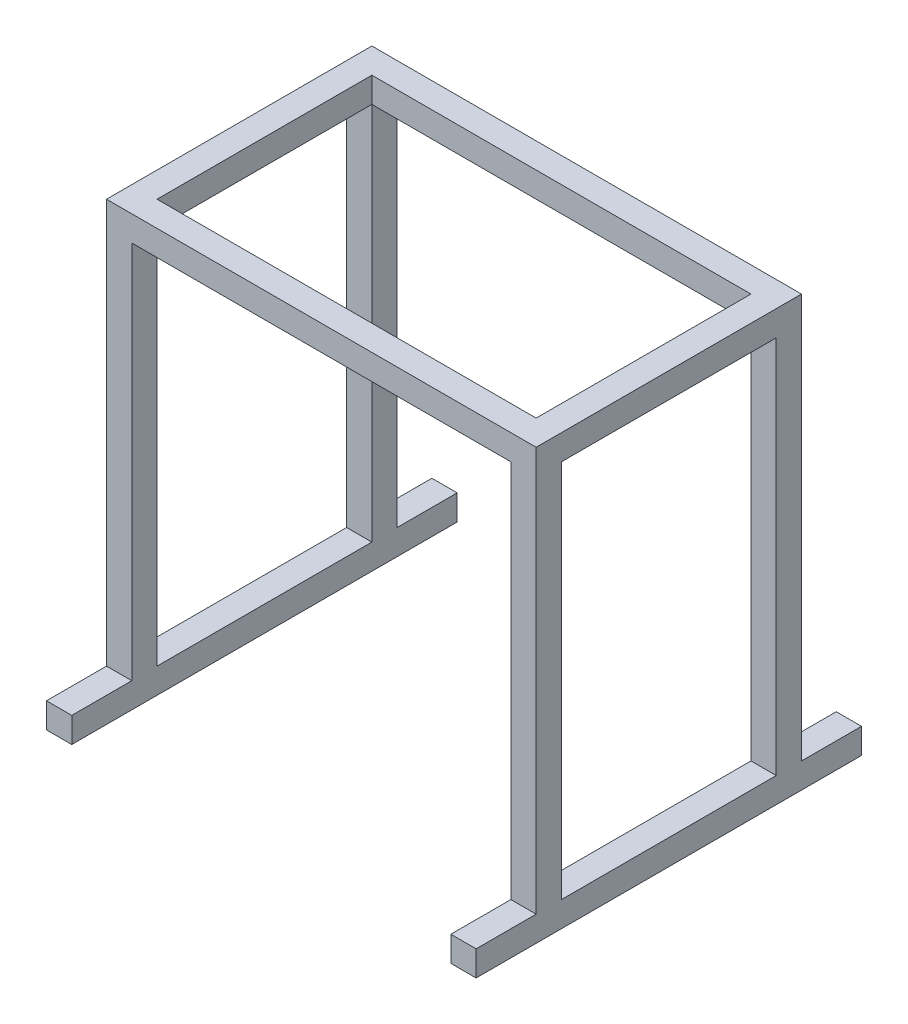
ISO-10303-21;
HEADER;
FILE_DESCRIPTION(('STEP AP214'),'2;1');
FILE_NAME('part.step','',(''),(''),'','','');
FILE_SCHEMA(('AUTOMOTIVE_DESIGN { 1 0 10303 214 1 1 1 1 }'));
ENDSEC;
DATA;
#1=APPLICATION_CONTEXT('core data for automotive mechanical design processes');
#2=APPLICATION_PROTOCOL_DEFINITION('international standard','automotive_design',2000,#1);
#3=PRODUCT_CONTEXT('',#1,'mechanical');
#4=PRODUCT('Part','Part','',(#3));
#5=PRODUCT_RELATED_PRODUCT_CATEGORY('part','',(#4));
#6=PRODUCT_DEFINITION_FORMATION('','',#4);
#7=PRODUCT_DEFINITION_CONTEXT('part definition',#1,'design');
#8=PRODUCT_DEFINITION('design','',#6,#7);
#9=PRODUCT_DEFINITION_SHAPE('','',#8);
#10=(LENGTH_UNIT() NAMED_UNIT(*) SI_UNIT(.MILLI.,.METRE.));
#11=(NAMED_UNIT(*) PLANE_ANGLE_UNIT() SI_UNIT($,.RADIAN.));
#12=(NAMED_UNIT(*) SI_UNIT($,.STERADIAN.) SOLID_ANGLE_UNIT());
#13=UNCERTAINTY_MEASURE_WITH_UNIT(LENGTH_MEASURE(1.E-05),#10,'distance_accuracy_value','');
#14=(GEOMETRIC_REPRESENTATION_CONTEXT(3) GLOBAL_UNCERTAINTY_ASSIGNED_CONTEXT((#13)) GLOBAL_UNIT_ASSIGNED_CONTEXT((#10,
#11,#12)) REPRESENTATION_CONTEXT('',''));
#15=CARTESIAN_POINT('',(0.,0.,0.));
#16=DIRECTION('',(0.,0.,1.));
#17=DIRECTION('',(1.,0.,0.));
#18=AXIS2_PLACEMENT_3D('',#15,#16,#17);
#19=CARTESIAN_POINT('',(150.,-320.,-152.5));
#20=DIRECTION('',(0.,1.,0.));
#21=DIRECTION('',(0.,0.,1.));
#22=AXIS2_PLACEMENT_3D('',#19,#20,#21);
#23=PLANE('',#22);
#24=DIRECTION('',(0.,0.,1.));
#25=VECTOR('',#24,1.);
#26=CARTESIAN_POINT('',(170.,-320.,-152.5));
#27=LINE('',#26,#25);
#28=CARTESIAN_POINT('',(170.,-320.,-152.5));
#29=VERTEX_POINT('',#28);
#30=CARTESIAN_POINT('',(170.,-320.,-105.));
#31=VERTEX_POINT('',#30);
#32=EDGE_CURVE('E216',#29,#31,#27,.T.);
#33=ORIENTED_EDGE('',*,*,#32,.F.);
#34=DIRECTION('',(-1.,0.,0.));
#35=VECTOR('',#34,1.);
#36=CARTESIAN_POINT('',(150.,-320.,-152.5));
#37=LINE('',#36,#35);
#38=CARTESIAN_POINT('',(150.,-320.,-152.5));
#39=VERTEX_POINT('',#38);
#40=EDGE_CURVE('E225',#29,#39,#37,.T.);
#41=ORIENTED_EDGE('',*,*,#40,.T.);
#42=DIRECTION('',(0.,0.,1.));
#43=VECTOR('',#42,1.);
#44=CARTESIAN_POINT('',(150.,-320.,-152.5));
#45=LINE('',#44,#43);
#46=CARTESIAN_POINT('',(150.,-320.,-105.));
#47=VERTEX_POINT('',#46);
#48=EDGE_CURVE('E236',#39,#47,#45,.T.);
#49=ORIENTED_EDGE('',*,*,#48,.T.);
#50=DIRECTION('',(-1.,0.,0.));
#51=VECTOR('',#50,1.);
#52=CARTESIAN_POINT('',(-170.,-320.,-105.));
#53=LINE('',#52,#51);
#54=EDGE_CURVE('E381',#31,#47,#53,.T.);
#55=ORIENTED_EDGE('',*,*,#54,.F.);
#56=EDGE_LOOP('',(#33,#41,#49,#55));
#57=FACE_BOUND('',#56,.T.);
#58=ADVANCED_FACE('F35',(#57),#23,.T.);
#59=CARTESIAN_POINT('',(170.,-320.,-85.));
#60=VERTEX_POINT('',#59);
#61=CARTESIAN_POINT('',(170.,-320.,85.));
#62=VERTEX_POINT('',#61);
#63=EDGE_CURVE('E546',#60,#62,#27,.T.);
#64=ORIENTED_EDGE('',*,*,#63,.F.);
#65=DIRECTION('',(1.,0.,0.));
#66=VECTOR('',#65,1.);
#67=CARTESIAN_POINT('',(0.,-320.,-85.));
#68=LINE('',#67,#66);
#69=CARTESIAN_POINT('',(150.,-320.,-85.));
#70=VERTEX_POINT('',#69);
#71=EDGE_CURVE('E318',#70,#60,#68,.T.);
#72=ORIENTED_EDGE('',*,*,#71,.F.);
#73=CARTESIAN_POINT('',(150.,-320.,85.));
#74=VERTEX_POINT('',#73);
#75=EDGE_CURVE('E239',#70,#74,#45,.T.);
#76=ORIENTED_EDGE('',*,*,#75,.T.);
#77=DIRECTION('',(-1.,0.,0.));
#78=VECTOR('',#77,1.);
#79=CARTESIAN_POINT('',(0.,-320.,85.));
#80=LINE('',#79,#78);
#81=EDGE_CURVE('E306',#62,#74,#80,.T.);
#82=ORIENTED_EDGE('',*,*,#81,.F.);
#83=EDGE_LOOP('',(#64,#72,#76,#82));
#84=FACE_BOUND('',#83,.T.);
#85=ADVANCED_FACE('F440',(#84),#23,.T.);
#86=CARTESIAN_POINT('',(-150.,-320.,-85.));
#87=DIRECTION('',(-1.,0.,0.));
#88=DIRECTION('',(0.,0.,1.));
#89=AXIS2_PLACEMENT_3D('',#86,#87,#88);
#90=PLANE('',#89);
#91=DIRECTION('',(0.,1.,0.));
#92=VECTOR('',#91,1.);
#93=CARTESIAN_POINT('',(-150.,-320.,85.));
#94=LINE('',#93,#92);
#95=CARTESIAN_POINT('',(-150.,-20.0000000000001,85.));
#96=VERTEX_POINT('',#95);
#97=CARTESIAN_POINT('',(-150.,0.,85.));
#98=VERTEX_POINT('',#97);
#99=EDGE_CURVE('E373',#96,#98,#94,.T.);
#100=ORIENTED_EDGE('',*,*,#99,.F.);
#101=DIRECTION('',(0.,0.,-1.));
#102=VECTOR('',#101,1.);
#103=CARTESIAN_POINT('',(-150.,-20.,-84.9999999999998));
#104=LINE('',#103,#102);
#105=CARTESIAN_POINT('',(-150.,-20.,-85.));
#106=VERTEX_POINT('',#105);
#107=EDGE_CURVE('E326',#96,#106,#104,.T.);
#108=ORIENTED_EDGE('',*,*,#107,.T.);
#109=DIRECTION('',(0.,1.,0.));
#110=VECTOR('',#109,1.);
#111=CARTESIAN_POINT('',(-150.,-320.,-85.));
#112=LINE('',#111,#110);
#113=CARTESIAN_POINT('',(-150.,0.,-85.));
#114=VERTEX_POINT('',#113);
#115=EDGE_CURVE('E376',#106,#114,#112,.T.);
#116=ORIENTED_EDGE('',*,*,#115,.T.);
#117=DIRECTION('',(0.,0.,1.));
#118=VECTOR('',#117,1.);
#119=CARTESIAN_POINT('',(-150.,0.,-85.));
#120=LINE('',#119,#118);
#121=EDGE_CURVE('E369',#114,#98,#120,.T.);
#122=ORIENTED_EDGE('',*,*,#121,.T.);
#123=EDGE_LOOP('',(#100,#108,#116,#122));
#124=FACE_BOUND('',#123,.T.);
#125=ADVANCED_FACE('F473',(#124),#90,.F.);
#126=CARTESIAN_POINT('',(150.,-320.,85.));
#127=DIRECTION('',(1.,0.,0.));
#128=DIRECTION('',(0.,0.,-1.));
#129=AXIS2_PLACEMENT_3D('',#126,#127,#128);
#130=PLANE('',#129);
#131=DIRECTION('',(0.,1.,0.));
#132=VECTOR('',#131,1.);
#133=CARTESIAN_POINT('',(150.,-320.,-85.));
#134=LINE('',#133,#132);
#135=CARTESIAN_POINT('',(150.,-20.,-85.));
#136=VERTEX_POINT('',#135);
#137=CARTESIAN_POINT('',(150.,0.,-85.));
#138=VERTEX_POINT('',#137);
#139=EDGE_CURVE('E378',#136,#138,#134,.T.);
#140=ORIENTED_EDGE('',*,*,#139,.F.);
#141=DIRECTION('',(0.,0.,1.));
#142=VECTOR('',#141,1.);
#143=CARTESIAN_POINT('',(150.,-20.0000000000001,85.0000000000002));
#144=LINE('',#143,#142);
#145=CARTESIAN_POINT('',(150.,-20.0000000000001,85.));
#146=VERTEX_POINT('',#145);
#147=EDGE_CURVE('E11',#136,#146,#144,.T.);
#148=ORIENTED_EDGE('',*,*,#147,.T.);
#149=DIRECTION('',(0.,1.,0.));
#150=VECTOR('',#149,1.);
#151=CARTESIAN_POINT('',(150.,-320.,85.));
#152=LINE('',#151,#150);
#153=CARTESIAN_POINT('',(150.,0.,85.));
#154=VERTEX_POINT('',#153);
#155=EDGE_CURVE('E372',#146,#154,#152,.T.);
#156=ORIENTED_EDGE('',*,*,#155,.T.);
#157=DIRECTION('',(0.,0.,-1.));
#158=VECTOR('',#157,1.);
#159=CARTESIAN_POINT('',(150.,0.,85.));
#160=LINE('',#159,#158);
#161=EDGE_CURVE('E363',#154,#138,#160,.T.);
#162=ORIENTED_EDGE('',*,*,#161,.T.);
#163=EDGE_LOOP('',(#140,#148,#156,#162));
#164=FACE_BOUND('',#163,.T.);
#165=ADVANCED_FACE('F458',(#164),#130,.F.);
#166=CARTESIAN_POINT('',(170.,-320.,105.));
#167=DIRECTION('',(1.,0.,0.));
#168=DIRECTION('',(0.,0.,-1.));
#169=AXIS2_PLACEMENT_3D('',#166,#167,#168);
#170=PLANE('',#169);
#171=ORIENTED_EDGE('',*,*,#32,.T.);
#172=DIRECTION('',(0.,1.,0.));
#173=VECTOR('',#172,1.);
#174=CARTESIAN_POINT('',(170.,-320.,-105.));
#175=LINE('',#174,#173);
#176=CARTESIAN_POINT('',(170.,0.,-105.));
#177=VERTEX_POINT('',#176);
#178=EDGE_CURVE('E389',#31,#177,#175,.T.);
#179=ORIENTED_EDGE('',*,*,#178,.T.);
#180=DIRECTION('',(0.,0.,-1.));
#181=VECTOR('',#180,1.);
#182=CARTESIAN_POINT('',(170.,0.,105.));
#183=LINE('',#182,#181);
#184=CARTESIAN_POINT('',(170.,0.,105.));
#185=VERTEX_POINT('',#184);
#186=EDGE_CURVE('E375',#185,#177,#183,.T.);
#187=ORIENTED_EDGE('',*,*,#186,.F.);
#188=DIRECTION('',(0.,1.,0.));
#189=VECTOR('',#188,1.);
#190=CARTESIAN_POINT('',(170.,-320.,105.));
#191=LINE('',#190,#189);
#192=CARTESIAN_POINT('',(170.,-320.,105.));
#193=VERTEX_POINT('',#192);
#194=EDGE_CURVE('E43',#193,#185,#191,.T.);
#195=ORIENTED_EDGE('',*,*,#194,.F.);
#196=CARTESIAN_POINT('',(170.,-320.,152.5));
#197=VERTEX_POINT('',#196);
#198=EDGE_CURVE('E50',#193,#197,#27,.T.);
#199=ORIENTED_EDGE('',*,*,#198,.T.);
#200=DIRECTION('',(0.,1.,0.));
#201=VECTOR('',#200,1.);
#202=CARTESIAN_POINT('',(170.,-340.,152.5));
#203=LINE('',#202,#201);
#204=CARTESIAN_POINT('',(170.,-340.,152.5));
#205=VERTEX_POINT('',#204);
#206=EDGE_CURVE('E211',#205,#197,#203,.T.);
#207=ORIENTED_EDGE('',*,*,#206,.F.);
#208=DIRECTION('',(0.,0.,1.));
#209=VECTOR('',#208,1.);
#210=CARTESIAN_POINT('',(170.,-340.,-152.5));
#211=LINE('',#210,#209);
#212=CARTESIAN_POINT('',(170.,-340.,-152.5));
#213=VERTEX_POINT('',#212);
#214=EDGE_CURVE('E206',#213,#205,#211,.T.);
#215=ORIENTED_EDGE('',*,*,#214,.F.);
#216=DIRECTION('',(0.,1.,0.));
#217=VECTOR('',#216,1.);
#218=CARTESIAN_POINT('',(170.,-340.,-152.5));
#219=LINE('',#218,#217);
#220=EDGE_CURVE('E209',#213,#29,#219,.T.);
#221=ORIENTED_EDGE('',*,*,#220,.T.);
#222=EDGE_LOOP('',(#171,#179,#187,#195,#199,#207,#215,#221));
#223=FACE_BOUND('',#222,.T.);
#224=DIRECTION('',(0.,-1.,0.));
#225=VECTOR('',#224,1.);
#226=CARTESIAN_POINT('',(170.,-620.,85.));
#227=LINE('',#226,#225);
#228=CARTESIAN_POINT('',(170.,-20.0000000000001,85.));
#229=VERTEX_POINT('',#228);
#230=EDGE_CURVE('E268',#229,#62,#227,.T.);
#231=ORIENTED_EDGE('',*,*,#230,.F.);
#232=DIRECTION('',(0.,0.,1.));
#233=VECTOR('',#232,1.);
#234=CARTESIAN_POINT('',(170.,-20.,-85.));
#235=LINE('',#234,#233);
#236=CARTESIAN_POINT('',(170.,-20.,-85.));
#237=VERTEX_POINT('',#236);
#238=EDGE_CURVE('E282',#237,#229,#235,.T.);
#239=ORIENTED_EDGE('',*,*,#238,.F.);
#240=DIRECTION('',(0.,1.,0.));
#241=VECTOR('',#240,1.);
#242=CARTESIAN_POINT('',(170.,-620.,-85.));
#243=LINE('',#242,#241);
#244=EDGE_CURVE('E291',#60,#237,#243,.T.);
#245=ORIENTED_EDGE('',*,*,#244,.F.);
#246=ORIENTED_EDGE('',*,*,#63,.T.);
#247=EDGE_LOOP('',(#231,#239,#245,#246));
#248=FACE_BOUND('',#247,.T.);
#249=ADVANCED_FACE('F37',(#223,#248),#170,.T.);
#250=CARTESIAN_POINT('',(-170.,-320.,105.));
#251=DIRECTION('',(0.,0.,1.));
#252=DIRECTION('',(1.,0.,0.));
#253=AXIS2_PLACEMENT_3D('',#250,#251,#252);
#254=PLANE('',#253);
#255=DIRECTION('',(0.,-1.,0.));
#256=VECTOR('',#255,1.);
#257=CARTESIAN_POINT('',(-150.,-620.,105.));
#258=LINE('',#257,#256);
#259=CARTESIAN_POINT('',(-150.,-20.,105.));
#260=VERTEX_POINT('',#259);
#261=CARTESIAN_POINT('',(-150.,-320.,105.));
#262=VERTEX_POINT('',#261);
#263=EDGE_CURVE('E329',#260,#262,#258,.T.);
#264=ORIENTED_EDGE('',*,*,#263,.F.);
#265=DIRECTION('',(-1.,0.,0.));
#266=VECTOR('',#265,1.);
#267=CARTESIAN_POINT('',(150.,-20.,105.));
#268=LINE('',#267,#266);
#269=CARTESIAN_POINT('',(150.,-20.,105.));
#270=VERTEX_POINT('',#269);
#271=EDGE_CURVE('E334',#270,#260,#268,.T.);
#272=ORIENTED_EDGE('',*,*,#271,.F.);
#273=DIRECTION('',(0.,1.,0.));
#274=VECTOR('',#273,1.);
#275=CARTESIAN_POINT('',(150.,-620.,105.));
#276=LINE('',#275,#274);
#277=CARTESIAN_POINT('',(150.,-320.,105.));
#278=VERTEX_POINT('',#277);
#279=EDGE_CURVE('E343',#278,#270,#276,.T.);
#280=ORIENTED_EDGE('',*,*,#279,.F.);
#281=DIRECTION('',(1.,0.,0.));
#282=VECTOR('',#281,1.);
#283=CARTESIAN_POINT('',(-170.,-320.,105.));
#284=LINE('',#283,#282);
#285=EDGE_CURVE('E384',#278,#193,#284,.T.);
#286=ORIENTED_EDGE('',*,*,#285,.T.);
#287=ORIENTED_EDGE('',*,*,#194,.T.);
#288=DIRECTION('',(1.,0.,0.));
#289=VECTOR('',#288,1.);
#290=CARTESIAN_POINT('',(-170.,0.,105.));
#291=LINE('',#290,#289);
#292=CARTESIAN_POINT('',(-170.,0.,105.));
#293=VERTEX_POINT('',#292);
#294=EDGE_CURVE('E398',#293,#185,#291,.T.);
#295=ORIENTED_EDGE('',*,*,#294,.F.);
#296=DIRECTION('',(0.,1.,0.));
#297=VECTOR('',#296,1.);
#298=CARTESIAN_POINT('',(-170.,-320.,105.));
#299=LINE('',#298,#297);
#300=CARTESIAN_POINT('',(-170.,-320.,105.));
#301=VERTEX_POINT('',#300);
#302=EDGE_CURVE('E402',#301,#293,#299,.T.);
#303=ORIENTED_EDGE('',*,*,#302,.F.);
#304=EDGE_CURVE('E386',#301,#262,#284,.T.);
#305=ORIENTED_EDGE('',*,*,#304,.T.);
#306=EDGE_LOOP('',(#264,#272,#280,#286,#287,#295,#303,#305));
#307=FACE_BOUND('',#306,.T.);
#308=ADVANCED_FACE('F420',(#307),#254,.T.);
#309=CARTESIAN_POINT('',(-170.,-320.,105.));
#310=DIRECTION('',(-1.,0.,0.));
#311=DIRECTION('',(0.,0.,1.));
#312=AXIS2_PLACEMENT_3D('',#309,#310,#311);
#313=PLANE('',#312);
#314=DIRECTION('',(0.,0.,1.));
#315=VECTOR('',#314,1.);
#316=CARTESIAN_POINT('',(-170.,-320.,-152.5));
#317=LINE('',#316,#315);
#318=CARTESIAN_POINT('',(-170.,-320.,152.5));
#319=VERTEX_POINT('',#318);
#320=EDGE_CURVE('E270',#301,#319,#317,.T.);
#321=ORIENTED_EDGE('',*,*,#320,.F.);
#322=ORIENTED_EDGE('',*,*,#302,.T.);
#323=DIRECTION('',(0.,0.,1.));
#324=VECTOR('',#323,1.);
#325=CARTESIAN_POINT('',(-170.,0.,105.));
#326=LINE('',#325,#324);
#327=CARTESIAN_POINT('',(-170.,0.,-105.));
#328=VERTEX_POINT('',#327);
#329=EDGE_CURVE('E395',#328,#293,#326,.T.);
#330=ORIENTED_EDGE('',*,*,#329,.F.);
#331=DIRECTION('',(0.,1.,0.));
#332=VECTOR('',#331,1.);
#333=CARTESIAN_POINT('',(-170.,-320.,-105.));
#334=LINE('',#333,#332);
#335=CARTESIAN_POINT('',(-170.,-320.,-105.));
#336=VERTEX_POINT('',#335);
#337=EDGE_CURVE('E404',#336,#328,#334,.T.);
#338=ORIENTED_EDGE('',*,*,#337,.F.);
#339=CARTESIAN_POINT('',(-170.,-320.,-152.5));
#340=VERTEX_POINT('',#339);
#341=EDGE_CURVE('E266',#340,#336,#317,.T.);
#342=ORIENTED_EDGE('',*,*,#341,.F.);
#343=DIRECTION('',(0.,-1.,0.));
#344=VECTOR('',#343,1.);
#345=CARTESIAN_POINT('',(-170.,-320.,-152.5));
#346=LINE('',#345,#344);
#347=CARTESIAN_POINT('',(-170.,-340.,-152.5));
#348=VERTEX_POINT('',#347);
#349=EDGE_CURVE('E253',#340,#348,#346,.T.);
#350=ORIENTED_EDGE('',*,*,#349,.T.);
#351=DIRECTION('',(0.,0.,1.));
#352=VECTOR('',#351,1.);
#353=CARTESIAN_POINT('',(-170.,-340.,-152.5));
#354=LINE('',#353,#352);
#355=CARTESIAN_POINT('',(-170.,-340.,152.5));
#356=VERTEX_POINT('',#355);
#357=EDGE_CURVE('E265',#348,#356,#354,.T.);
#358=ORIENTED_EDGE('',*,*,#357,.T.);
#359=DIRECTION('',(0.,-1.,0.));
#360=VECTOR('',#359,1.);
#361=CARTESIAN_POINT('',(-170.,-320.,152.5));
#362=LINE('',#361,#360);
#363=EDGE_CURVE('E238',#319,#356,#362,.T.);
#364=ORIENTED_EDGE('',*,*,#363,.F.);
#365=EDGE_LOOP('',(#321,#322,#330,#338,#342,#350,#358,#364));
#366=FACE_BOUND('',#365,.T.);
#367=DIRECTION('',(0.,-1.,0.));
#368=VECTOR('',#367,1.);
#369=CARTESIAN_POINT('',(-170.,-620.,85.));
#370=LINE('',#369,#368);
#371=CARTESIAN_POINT('',(-170.,-20.0000000000001,85.));
#372=VERTEX_POINT('',#371);
#373=CARTESIAN_POINT('',(-170.,-320.,85.));
#374=VERTEX_POINT('',#373);
#375=EDGE_CURVE('E278',#372,#374,#370,.T.);
#376=ORIENTED_EDGE('',*,*,#375,.T.);
#377=CARTESIAN_POINT('',(-170.,-320.,-85.));
#378=VERTEX_POINT('',#377);
#379=EDGE_CURVE('E269',#378,#374,#317,.T.);
#380=ORIENTED_EDGE('',*,*,#379,.F.);
#381=DIRECTION('',(0.,1.,0.));
#382=VECTOR('',#381,1.);
#383=CARTESIAN_POINT('',(-170.,-620.,-85.));
#384=LINE('',#383,#382);
#385=CARTESIAN_POINT('',(-170.,-20.,-85.));
#386=VERTEX_POINT('',#385);
#387=EDGE_CURVE('E281',#378,#386,#384,.T.);
#388=ORIENTED_EDGE('',*,*,#387,.T.);
#389=DIRECTION('',(0.,0.,1.));
#390=VECTOR('',#389,1.);
#391=CARTESIAN_POINT('',(-170.,-20.,-85.));
#392=LINE('',#391,#390);
#393=EDGE_CURVE('E285',#386,#372,#392,.T.);
#394=ORIENTED_EDGE('',*,*,#393,.T.);
#395=EDGE_LOOP('',(#376,#380,#388,#394));
#396=FACE_BOUND('',#395,.T.);
#397=ADVANCED_FACE('F497',(#366,#396),#313,.T.);
#398=CARTESIAN_POINT('',(-170.,-320.,-105.));
#399=DIRECTION('',(0.,0.,-1.));
#400=DIRECTION('',(-1.,0.,0.));
#401=AXIS2_PLACEMENT_3D('',#398,#399,#400);
#402=PLANE('',#401);
#403=DIRECTION('',(0.,-1.,0.));
#404=VECTOR('',#403,1.);
#405=CARTESIAN_POINT('',(-150.,-620.,-105.));
#406=LINE('',#405,#404);
#407=CARTESIAN_POINT('',(-150.,-20.,-105.));
#408=VERTEX_POINT('',#407);
#409=CARTESIAN_POINT('',(-150.,-320.,-105.));
#410=VERTEX_POINT('',#409);
#411=EDGE_CURVE('E330',#408,#410,#406,.T.);
#412=ORIENTED_EDGE('',*,*,#411,.T.);
#413=EDGE_CURVE('E385',#410,#336,#53,.T.);
#414=ORIENTED_EDGE('',*,*,#413,.T.);
#415=ORIENTED_EDGE('',*,*,#337,.T.);
#416=DIRECTION('',(-1.,0.,0.));
#417=VECTOR('',#416,1.);
#418=CARTESIAN_POINT('',(-170.,0.,-105.));
#419=LINE('',#418,#417);
#420=EDGE_CURVE('E392',#177,#328,#419,.T.);
#421=ORIENTED_EDGE('',*,*,#420,.F.);
#422=ORIENTED_EDGE('',*,*,#178,.F.);
#423=ORIENTED_EDGE('',*,*,#54,.T.);
#424=DIRECTION('',(0.,1.,0.));
#425=VECTOR('',#424,1.);
#426=CARTESIAN_POINT('',(150.,-620.,-105.));
#427=LINE('',#426,#425);
#428=CARTESIAN_POINT('',(150.,-20.,-105.));
#429=VERTEX_POINT('',#428);
#430=EDGE_CURVE('E333',#47,#429,#427,.T.);
#431=ORIENTED_EDGE('',*,*,#430,.T.);
#432=DIRECTION('',(-1.,0.,0.));
#433=VECTOR('',#432,1.);
#434=CARTESIAN_POINT('',(150.,-20.,-105.));
#435=LINE('',#434,#433);
#436=EDGE_CURVE('E337',#429,#408,#435,.T.);
#437=ORIENTED_EDGE('',*,*,#436,.T.);
#438=EDGE_LOOP('',(#412,#414,#415,#421,#422,#423,#431,#437));
#439=FACE_BOUND('',#438,.T.);
#440=ADVANCED_FACE('F410',(#439),#402,.T.);
#441=CARTESIAN_POINT('',(0.,0.,0.));
#442=DIRECTION('',(0.,-1.,0.));
#443=DIRECTION('',(0.,0.,-1.));
#444=AXIS2_PLACEMENT_3D('',#441,#442,#443);
#445=PLANE('',#444);
#446=ORIENTED_EDGE('',*,*,#161,.F.);
#447=DIRECTION('',(1.,0.,0.));
#448=VECTOR('',#447,1.);
#449=CARTESIAN_POINT('',(-150.,0.,85.));
#450=LINE('',#449,#448);
#451=EDGE_CURVE('E360',#98,#154,#450,.T.);
#452=ORIENTED_EDGE('',*,*,#451,.F.);
#453=ORIENTED_EDGE('',*,*,#121,.F.);
#454=DIRECTION('',(-1.,0.,0.));
#455=VECTOR('',#454,1.);
#456=CARTESIAN_POINT('',(150.,0.,-85.));
#457=LINE('',#456,#455);
#458=EDGE_CURVE('E366',#138,#114,#457,.T.);
#459=ORIENTED_EDGE('',*,*,#458,.F.);
#460=EDGE_LOOP('',(#446,#452,#453,#459));
#461=FACE_BOUND('',#460,.T.);
#462=ORIENTED_EDGE('',*,*,#186,.T.);
#463=ORIENTED_EDGE('',*,*,#420,.T.);
#464=ORIENTED_EDGE('',*,*,#329,.T.);
#465=ORIENTED_EDGE('',*,*,#294,.T.);
#466=EDGE_LOOP('',(#462,#463,#464,#465));
#467=FACE_BOUND('',#466,.T.);
#468=ADVANCED_FACE('F415',(#461,#467),#445,.F.);
#469=CARTESIAN_POINT('',(-150.,-320.,85.));
#470=DIRECTION('',(0.,0.,1.));
#471=DIRECTION('',(1.,0.,0.));
#472=AXIS2_PLACEMENT_3D('',#469,#470,#471);
#473=PLANE('',#472);
#474=ORIENTED_EDGE('',*,*,#155,.F.);
#475=DIRECTION('',(-1.,0.,0.));
#476=VECTOR('',#475,1.);
#477=CARTESIAN_POINT('',(-150.,-20.0000000000001,85.));
#478=LINE('',#477,#476);
#479=EDGE_CURVE('E357',#146,#96,#478,.T.);
#480=ORIENTED_EDGE('',*,*,#479,.T.);
#481=ORIENTED_EDGE('',*,*,#99,.T.);
#482=ORIENTED_EDGE('',*,*,#451,.T.);
#483=EDGE_LOOP('',(#474,#480,#481,#482));
#484=FACE_BOUND('',#483,.T.);
#485=ADVANCED_FACE('F453',(#484),#473,.F.);
#486=DIRECTION('',(0.,0.,1.));
#487=VECTOR('',#486,1.);
#488=CARTESIAN_POINT('',(-150.,-20.,-105.));
#489=LINE('',#488,#487);
#490=EDGE_CURVE('E347',#408,#106,#489,.T.);
#491=ORIENTED_EDGE('',*,*,#490,.T.);
#492=DIRECTION('',(0.,-1.,0.));
#493=VECTOR('',#492,1.);
#494=CARTESIAN_POINT('',(-150.,-320.,-85.));
#495=LINE('',#494,#493);
#496=CARTESIAN_POINT('',(-150.,-320.,-85.));
#497=VERTEX_POINT('',#496);
#498=EDGE_CURVE('E321',#106,#497,#495,.T.);
#499=ORIENTED_EDGE('',*,*,#498,.T.);
#500=DIRECTION('',(0.,0.,1.));
#501=VECTOR('',#500,1.);
#502=CARTESIAN_POINT('',(-150.,-320.,-152.5));
#503=LINE('',#502,#501);
#504=CARTESIAN_POINT('',(-150.,-320.,85.));
#505=VERTEX_POINT('',#504);
#506=EDGE_CURVE('E58',#497,#505,#503,.T.);
#507=ORIENTED_EDGE('',*,*,#506,.T.);
#508=DIRECTION('',(0.,1.,0.));
#509=VECTOR('',#508,1.);
#510=CARTESIAN_POINT('',(-150.,-320.,85.));
#511=LINE('',#510,#509);
#512=EDGE_CURVE('E309',#505,#96,#511,.T.);
#513=ORIENTED_EDGE('',*,*,#512,.T.);
#514=EDGE_CURVE('E351',#96,#260,#489,.T.);
#515=ORIENTED_EDGE('',*,*,#514,.T.);
#516=ORIENTED_EDGE('',*,*,#263,.T.);
#517=CARTESIAN_POINT('',(-150.,-320.,152.5));
#518=VERTEX_POINT('',#517);
#519=EDGE_CURVE('E274',#262,#518,#503,.T.);
#520=ORIENTED_EDGE('',*,*,#519,.T.);
#521=DIRECTION('',(0.,1.,0.));
#522=VECTOR('',#521,1.);
#523=CARTESIAN_POINT('',(-150.,-320.,152.5));
#524=LINE('',#523,#522);
#525=CARTESIAN_POINT('',(-150.,-340.,152.5));
#526=VERTEX_POINT('',#525);
#527=EDGE_CURVE('E247',#526,#518,#524,.T.);
#528=ORIENTED_EDGE('',*,*,#527,.F.);
#529=DIRECTION('',(0.,0.,1.));
#530=VECTOR('',#529,1.);
#531=CARTESIAN_POINT('',(-150.,-340.,-152.5));
#532=LINE('',#531,#530);
#533=CARTESIAN_POINT('',(-150.,-340.,-152.5));
#534=VERTEX_POINT('',#533);
#535=EDGE_CURVE('E275',#534,#526,#532,.T.);
#536=ORIENTED_EDGE('',*,*,#535,.F.);
#537=DIRECTION('',(0.,1.,0.));
#538=VECTOR('',#537,1.);
#539=CARTESIAN_POINT('',(-150.,-320.,-152.5));
#540=LINE('',#539,#538);
#541=CARTESIAN_POINT('',(-150.,-320.,-152.5));
#542=VERTEX_POINT('',#541);
#543=EDGE_CURVE('E259',#534,#542,#540,.T.);
#544=ORIENTED_EDGE('',*,*,#543,.T.);
#545=EDGE_CURVE('E271',#542,#410,#503,.T.);
#546=ORIENTED_EDGE('',*,*,#545,.T.);
#547=ORIENTED_EDGE('',*,*,#411,.F.);
#548=EDGE_LOOP('',(#491,#499,#507,#513,#515,#516,#520,#528,#536,#544,#546,#547));
#549=FACE_BOUND('',#548,.T.);
#550=ADVANCED_FACE('F482',(#549),#90,.F.);
#551=CARTESIAN_POINT('',(150.,-320.,-85.));
#552=DIRECTION('',(0.,0.,-1.));
#553=DIRECTION('',(-1.,0.,0.));
#554=AXIS2_PLACEMENT_3D('',#551,#552,#553);
#555=PLANE('',#554);
#556=ORIENTED_EDGE('',*,*,#115,.F.);
#557=DIRECTION('',(1.,0.,0.));
#558=VECTOR('',#557,1.);
#559=CARTESIAN_POINT('',(150.,-20.,-85.));
#560=LINE('',#559,#558);
#561=EDGE_CURVE('E350',#106,#136,#560,.T.);
#562=ORIENTED_EDGE('',*,*,#561,.T.);
#563=ORIENTED_EDGE('',*,*,#139,.T.);
#564=ORIENTED_EDGE('',*,*,#458,.T.);
#565=EDGE_LOOP('',(#556,#562,#563,#564));
#566=FACE_BOUND('',#565,.T.);
#567=ADVANCED_FACE('F470',(#566),#555,.F.);
#568=ORIENTED_EDGE('',*,*,#430,.F.);
#569=ORIENTED_EDGE('',*,*,#48,.F.);
#570=DIRECTION('',(0.,-1.,0.));
#571=VECTOR('',#570,1.);
#572=CARTESIAN_POINT('',(150.,-320.,-152.5));
#573=LINE('',#572,#571);
#574=CARTESIAN_POINT('',(150.,-340.,-152.5));
#575=VERTEX_POINT('',#574);
#576=EDGE_CURVE('E229',#39,#575,#573,.T.);
#577=ORIENTED_EDGE('',*,*,#576,.T.);
#578=DIRECTION('',(0.,0.,1.));
#579=VECTOR('',#578,1.);
#580=CARTESIAN_POINT('',(150.,-340.,-152.5));
#581=LINE('',#580,#579);
#582=CARTESIAN_POINT('',(150.,-340.,152.5));
#583=VERTEX_POINT('',#582);
#584=EDGE_CURVE('E228',#575,#583,#581,.T.);
#585=ORIENTED_EDGE('',*,*,#584,.T.);
#586=DIRECTION('',(0.,-1.,0.));
#587=VECTOR('',#586,1.);
#588=CARTESIAN_POINT('',(150.,-320.,152.5));
#589=LINE('',#588,#587);
#590=CARTESIAN_POINT('',(150.,-320.,152.5));
#591=VERTEX_POINT('',#590);
#592=EDGE_CURVE('E436',#591,#583,#589,.T.);
#593=ORIENTED_EDGE('',*,*,#592,.F.);
#594=EDGE_CURVE('E240',#278,#591,#45,.T.);
#595=ORIENTED_EDGE('',*,*,#594,.F.);
#596=ORIENTED_EDGE('',*,*,#279,.T.);
#597=DIRECTION('',(0.,0.,1.));
#598=VECTOR('',#597,1.);
#599=CARTESIAN_POINT('',(150.,-20.,-105.));
#600=LINE('',#599,#598);
#601=EDGE_CURVE('E340',#146,#270,#600,.T.);
#602=ORIENTED_EDGE('',*,*,#601,.F.);
#603=DIRECTION('',(0.,-1.,0.));
#604=VECTOR('',#603,1.);
#605=CARTESIAN_POINT('',(150.,-320.,85.));
#606=LINE('',#605,#604);
#607=EDGE_CURVE('E299',#146,#74,#606,.T.);
#608=ORIENTED_EDGE('',*,*,#607,.T.);
#609=ORIENTED_EDGE('',*,*,#75,.F.);
#610=DIRECTION('',(0.,1.,0.));
#611=VECTOR('',#610,1.);
#612=CARTESIAN_POINT('',(150.,-320.,-85.));
#613=LINE('',#612,#611);
#614=EDGE_CURVE('E315',#70,#136,#613,.T.);
#615=ORIENTED_EDGE('',*,*,#614,.T.);
#616=EDGE_CURVE('E352',#429,#136,#600,.T.);
#617=ORIENTED_EDGE('',*,*,#616,.F.);
#618=EDGE_LOOP('',(#568,#569,#577,#585,#593,#595,#596,#602,#608,#609,#615,#617));
#619=FACE_BOUND('',#618,.T.);
#620=ADVANCED_FACE('F432',(#619),#130,.F.);
#621=CARTESIAN_POINT('',(150.,-20.,-105.));
#622=DIRECTION('',(0.,1.,0.));
#623=DIRECTION('',(-1.,0.,0.));
#624=AXIS2_PLACEMENT_3D('',#621,#622,#623);
#625=PLANE('',#624);
#626=ORIENTED_EDGE('',*,*,#490,.F.);
#627=ORIENTED_EDGE('',*,*,#436,.F.);
#628=ORIENTED_EDGE('',*,*,#616,.T.);
#629=ORIENTED_EDGE('',*,*,#561,.F.);
#630=EDGE_LOOP('',(#626,#627,#628,#629));
#631=FACE_BOUND('',#630,.T.);
#632=ADVANCED_FACE('F467',(#631),#625,.F.);
#633=ORIENTED_EDGE('',*,*,#601,.T.);
#634=ORIENTED_EDGE('',*,*,#271,.T.);
#635=ORIENTED_EDGE('',*,*,#514,.F.);
#636=ORIENTED_EDGE('',*,*,#479,.F.);
#637=EDGE_LOOP('',(#633,#634,#635,#636));
#638=FACE_BOUND('',#637,.T.);
#639=ADVANCED_FACE('F450',(#638),#625,.F.);
#640=CARTESIAN_POINT('',(-170.,-620.,-85.));
#641=DIRECTION('',(0.,0.,-1.));
#642=DIRECTION('',(0.,1.,0.));
#643=AXIS2_PLACEMENT_3D('',#640,#641,#642);
#644=PLANE('',#643);
#645=ORIENTED_EDGE('',*,*,#71,.T.);
#646=ORIENTED_EDGE('',*,*,#244,.T.);
#647=DIRECTION('',(1.,0.,0.));
#648=VECTOR('',#647,1.);
#649=CARTESIAN_POINT('',(-170.,-20.,-85.));
#650=LINE('',#649,#648);
#651=EDGE_CURVE('E288',#136,#237,#650,.T.);
#652=ORIENTED_EDGE('',*,*,#651,.F.);
#653=ORIENTED_EDGE('',*,*,#614,.F.);
#654=EDGE_LOOP('',(#645,#646,#652,#653));
#655=FACE_BOUND('',#654,.T.);
#656=ADVANCED_FACE('F502',(#655),#644,.F.);
#657=CARTESIAN_POINT('',(-170.,-20.,-85.));
#658=DIRECTION('',(0.,1.,0.));
#659=DIRECTION('',(0.,0.,1.));
#660=AXIS2_PLACEMENT_3D('',#657,#658,#659);
#661=PLANE('',#660);
#662=ORIENTED_EDGE('',*,*,#651,.T.);
#663=ORIENTED_EDGE('',*,*,#238,.T.);
#664=DIRECTION('',(1.,0.,0.));
#665=VECTOR('',#664,1.);
#666=CARTESIAN_POINT('',(-170.,-20.0000000000001,85.));
#667=LINE('',#666,#665);
#668=EDGE_CURVE('E300',#146,#229,#667,.T.);
#669=ORIENTED_EDGE('',*,*,#668,.F.);
#670=ORIENTED_EDGE('',*,*,#147,.F.);
#671=EDGE_LOOP('',(#662,#663,#669,#670));
#672=FACE_BOUND('',#671,.T.);
#673=ADVANCED_FACE('F462',(#672),#661,.F.);
#674=CARTESIAN_POINT('',(-170.,-620.,85.));
#675=DIRECTION('',(0.,0.,1.));
#676=DIRECTION('',(0.,-1.,0.));
#677=AXIS2_PLACEMENT_3D('',#674,#675,#676);
#678=PLANE('',#677);
#679=ORIENTED_EDGE('',*,*,#81,.T.);
#680=ORIENTED_EDGE('',*,*,#607,.F.);
#681=ORIENTED_EDGE('',*,*,#668,.T.);
#682=ORIENTED_EDGE('',*,*,#230,.T.);
#683=EDGE_LOOP('',(#679,#680,#681,#682));
#684=FACE_BOUND('',#683,.T.);
#685=ADVANCED_FACE('F443',(#684),#678,.F.);
#686=EDGE_CURVE('E296',#372,#96,#667,.T.);
#687=ORIENTED_EDGE('',*,*,#686,.F.);
#688=ORIENTED_EDGE('',*,*,#393,.F.);
#689=EDGE_CURVE('E301',#386,#106,#650,.T.);
#690=ORIENTED_EDGE('',*,*,#689,.T.);
#691=ORIENTED_EDGE('',*,*,#107,.F.);
#692=EDGE_LOOP('',(#687,#688,#690,#691));
#693=FACE_BOUND('',#692,.T.);
#694=ADVANCED_FACE('F475',(#693),#661,.F.);
#695=DIRECTION('',(1.,0.,0.));
#696=VECTOR('',#695,1.);
#697=CARTESIAN_POINT('',(0.,-320.,-85.));
#698=LINE('',#697,#696);
#699=EDGE_CURVE('E324',#378,#497,#698,.T.);
#700=ORIENTED_EDGE('',*,*,#699,.T.);
#701=ORIENTED_EDGE('',*,*,#498,.F.);
#702=ORIENTED_EDGE('',*,*,#689,.F.);
#703=ORIENTED_EDGE('',*,*,#387,.F.);
#704=EDGE_LOOP('',(#700,#701,#702,#703));
#705=FACE_BOUND('',#704,.T.);
#706=ADVANCED_FACE('F499',(#705),#644,.F.);
#707=DIRECTION('',(-1.,0.,0.));
#708=VECTOR('',#707,1.);
#709=CARTESIAN_POINT('',(0.,-320.,85.));
#710=LINE('',#709,#708);
#711=EDGE_CURVE('E312',#505,#374,#710,.T.);
#712=ORIENTED_EDGE('',*,*,#711,.T.);
#713=ORIENTED_EDGE('',*,*,#375,.F.);
#714=ORIENTED_EDGE('',*,*,#686,.T.);
#715=ORIENTED_EDGE('',*,*,#512,.F.);
#716=EDGE_LOOP('',(#712,#713,#714,#715));
#717=FACE_BOUND('',#716,.T.);
#718=ADVANCED_FACE('F480',(#717),#678,.F.);
#719=CARTESIAN_POINT('',(-170.,-320.,-152.5));
#720=DIRECTION('',(0.,1.,0.));
#721=DIRECTION('',(0.,0.,1.));
#722=AXIS2_PLACEMENT_3D('',#719,#720,#721);
#723=PLANE('',#722);
#724=ORIENTED_EDGE('',*,*,#699,.F.);
#725=ORIENTED_EDGE('',*,*,#379,.T.);
#726=ORIENTED_EDGE('',*,*,#711,.F.);
#727=ORIENTED_EDGE('',*,*,#506,.F.);
#728=EDGE_LOOP('',(#724,#725,#726,#727));
#729=FACE_BOUND('',#728,.T.);
#730=ADVANCED_FACE('F494',(#729),#723,.T.);
#731=ORIENTED_EDGE('',*,*,#341,.T.);
#732=ORIENTED_EDGE('',*,*,#413,.F.);
#733=ORIENTED_EDGE('',*,*,#545,.F.);
#734=DIRECTION('',(-1.,0.,0.));
#735=VECTOR('',#734,1.);
#736=CARTESIAN_POINT('',(-170.,-320.,-152.5));
#737=LINE('',#736,#735);
#738=EDGE_CURVE('E262',#542,#340,#737,.T.);
#739=ORIENTED_EDGE('',*,*,#738,.T.);
#740=EDGE_LOOP('',(#731,#732,#733,#739));
#741=FACE_BOUND('',#740,.T.);
#742=ADVANCED_FACE('F534',(#741),#723,.T.);
#743=ORIENTED_EDGE('',*,*,#519,.F.);
#744=ORIENTED_EDGE('',*,*,#304,.F.);
#745=ORIENTED_EDGE('',*,*,#320,.T.);
#746=DIRECTION('',(-1.,0.,0.));
#747=VECTOR('',#746,1.);
#748=CARTESIAN_POINT('',(-170.,-320.,152.5));
#749=LINE('',#748,#747);
#750=EDGE_CURVE('E250',#518,#319,#749,.T.);
#751=ORIENTED_EDGE('',*,*,#750,.F.);
#752=EDGE_LOOP('',(#743,#744,#745,#751));
#753=FACE_BOUND('',#752,.T.);
#754=ADVANCED_FACE('F490',(#753),#723,.T.);
#755=CARTESIAN_POINT('',(-170.,-340.,-152.5));
#756=DIRECTION('',(0.,-1.,0.));
#757=DIRECTION('',(0.,0.,-1.));
#758=AXIS2_PLACEMENT_3D('',#755,#756,#757);
#759=PLANE('',#758);
#760=ORIENTED_EDGE('',*,*,#535,.T.);
#761=DIRECTION('',(1.,0.,0.));
#762=VECTOR('',#761,1.);
#763=CARTESIAN_POINT('',(-170.,-340.,152.5));
#764=LINE('',#763,#762);
#765=EDGE_CURVE('E244',#356,#526,#764,.T.);
#766=ORIENTED_EDGE('',*,*,#765,.F.);
#767=ORIENTED_EDGE('',*,*,#357,.F.);
#768=DIRECTION('',(1.,0.,0.));
#769=VECTOR('',#768,1.);
#770=CARTESIAN_POINT('',(-170.,-340.,-152.5));
#771=LINE('',#770,#769);
#772=EDGE_CURVE('E256',#348,#534,#771,.T.);
#773=ORIENTED_EDGE('',*,*,#772,.T.);
#774=EDGE_LOOP('',(#760,#766,#767,#773));
#775=FACE_BOUND('',#774,.T.);
#776=ADVANCED_FACE('F528',(#775),#759,.T.);
#777=CARTESIAN_POINT('',(0.,0.,-152.5));
#778=DIRECTION('',(0.,0.,1.));
#779=DIRECTION('',(1.,0.,0.));
#780=AXIS2_PLACEMENT_3D('',#777,#778,#779);
#781=PLANE('',#780);
#782=ORIENTED_EDGE('',*,*,#349,.F.);
#783=ORIENTED_EDGE('',*,*,#738,.F.);
#784=ORIENTED_EDGE('',*,*,#543,.F.);
#785=ORIENTED_EDGE('',*,*,#772,.F.);
#786=EDGE_LOOP('',(#782,#783,#784,#785));
#787=FACE_BOUND('',#786,.T.);
#788=ADVANCED_FACE('F523',(#787),#781,.F.);
#789=CARTESIAN_POINT('',(0.,0.,152.5));
#790=DIRECTION('',(0.,0.,1.));
#791=DIRECTION('',(1.,0.,0.));
#792=AXIS2_PLACEMENT_3D('',#789,#790,#791);
#793=PLANE('',#792);
#794=ORIENTED_EDGE('',*,*,#363,.T.);
#795=ORIENTED_EDGE('',*,*,#765,.T.);
#796=ORIENTED_EDGE('',*,*,#527,.T.);
#797=ORIENTED_EDGE('',*,*,#750,.T.);
#798=EDGE_LOOP('',(#794,#795,#796,#797));
#799=FACE_BOUND('',#798,.T.);
#800=ADVANCED_FACE('F487',(#799),#793,.T.);
#801=ORIENTED_EDGE('',*,*,#198,.F.);
#802=ORIENTED_EDGE('',*,*,#285,.F.);
#803=ORIENTED_EDGE('',*,*,#594,.T.);
#804=DIRECTION('',(-1.,0.,0.));
#805=VECTOR('',#804,1.);
#806=CARTESIAN_POINT('',(150.,-320.,152.5));
#807=LINE('',#806,#805);
#808=EDGE_CURVE('E232',#197,#591,#807,.T.);
#809=ORIENTED_EDGE('',*,*,#808,.F.);
#810=EDGE_LOOP('',(#801,#802,#803,#809));
#811=FACE_BOUND('',#810,.T.);
#812=ADVANCED_FACE('F427',(#811),#23,.T.);
#813=CARTESIAN_POINT('',(150.,-340.,-152.5));
#814=DIRECTION('',(0.,-1.,0.));
#815=DIRECTION('',(0.,0.,-1.));
#816=AXIS2_PLACEMENT_3D('',#813,#814,#815);
#817=PLANE('',#816);
#818=ORIENTED_EDGE('',*,*,#214,.T.);
#819=DIRECTION('',(1.,0.,0.));
#820=VECTOR('',#819,1.);
#821=CARTESIAN_POINT('',(150.,-340.,152.5));
#822=LINE('',#821,#820);
#823=EDGE_CURVE('E551',#583,#205,#822,.T.);
#824=ORIENTED_EDGE('',*,*,#823,.F.);
#825=ORIENTED_EDGE('',*,*,#584,.F.);
#826=DIRECTION('',(1.,0.,0.));
#827=VECTOR('',#826,1.);
#828=CARTESIAN_POINT('',(150.,-340.,-152.5));
#829=LINE('',#828,#827);
#830=EDGE_CURVE('E223',#575,#213,#829,.T.);
#831=ORIENTED_EDGE('',*,*,#830,.T.);
#832=EDGE_LOOP('',(#818,#824,#825,#831));
#833=FACE_BOUND('',#832,.T.);
#834=ADVANCED_FACE('F227',(#833),#817,.T.);
#835=CARTESIAN_POINT('',(0.,0.,-152.5));
#836=DIRECTION('',(0.,0.,1.));
#837=DIRECTION('',(1.,0.,0.));
#838=AXIS2_PLACEMENT_3D('',#835,#836,#837);
#839=PLANE('',#838);
#840=ORIENTED_EDGE('',*,*,#40,.F.);
#841=ORIENTED_EDGE('',*,*,#220,.F.);
#842=ORIENTED_EDGE('',*,*,#830,.F.);
#843=ORIENTED_EDGE('',*,*,#576,.F.);
#844=EDGE_LOOP('',(#840,#841,#842,#843));
#845=FACE_BOUND('',#844,.T.);
#846=ADVANCED_FACE('F221',(#845),#839,.F.);
#847=CARTESIAN_POINT('',(0.,0.,152.5));
#848=DIRECTION('',(0.,0.,1.));
#849=DIRECTION('',(1.,0.,0.));
#850=AXIS2_PLACEMENT_3D('',#847,#848,#849);
#851=PLANE('',#850);
#852=ORIENTED_EDGE('',*,*,#206,.T.);
#853=ORIENTED_EDGE('',*,*,#808,.T.);
#854=ORIENTED_EDGE('',*,*,#592,.T.);
#855=ORIENTED_EDGE('',*,*,#823,.T.);
#856=EDGE_LOOP('',(#852,#853,#854,#855));
#857=FACE_BOUND('',#856,.T.);
#858=ADVANCED_FACE('F553',(#857),#851,.T.);
#859=CLOSED_SHELL('',(#58,#85,#125,#165,#249,#308,#397,#440,#468,#485,#550,#567,#620,#632,#639,
#656,#673,#685,#694,#706,#718,#730,#742,#754,#776,#788,#800,#812,#834,#846,#858));
#860=MANIFOLD_SOLID_BREP('B2',#859);
#861=ADVANCED_BREP_SHAPE_REPRESENTATION('',(#18,#860),#14);
#862=SHAPE_DEFINITION_REPRESENTATION(#9,#861);
ENDSEC;
END-ISO-10303-21;
